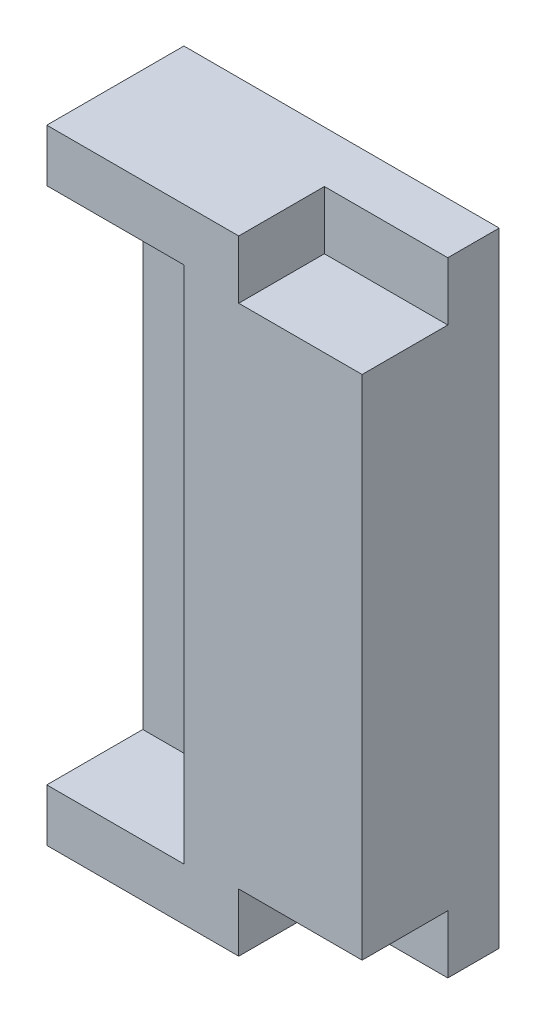
ISO-10303-21;
HEADER;
FILE_DESCRIPTION(('STEP AP214'),'2;1');
FILE_NAME('part.step','',(''),(''),'','','');
FILE_SCHEMA(('AUTOMOTIVE_DESIGN { 1 0 10303 214 1 1 1 1 }'));
ENDSEC;
DATA;
#1=APPLICATION_CONTEXT('core data for automotive mechanical design processes');
#2=APPLICATION_PROTOCOL_DEFINITION('international standard','automotive_design',2000,#1);
#3=PRODUCT_CONTEXT('',#1,'mechanical');
#4=PRODUCT('Part','Part','',(#3));
#5=PRODUCT_RELATED_PRODUCT_CATEGORY('part','',(#4));
#6=PRODUCT_DEFINITION_FORMATION('','',#4);
#7=PRODUCT_DEFINITION_CONTEXT('part definition',#1,'design');
#8=PRODUCT_DEFINITION('design','',#6,#7);
#9=PRODUCT_DEFINITION_SHAPE('','',#8);
#10=(LENGTH_UNIT() NAMED_UNIT(*) SI_UNIT(.MILLI.,.METRE.));
#11=(NAMED_UNIT(*) PLANE_ANGLE_UNIT() SI_UNIT($,.RADIAN.));
#12=(NAMED_UNIT(*) SI_UNIT($,.STERADIAN.) SOLID_ANGLE_UNIT());
#13=UNCERTAINTY_MEASURE_WITH_UNIT(LENGTH_MEASURE(1.E-05),#10,'distance_accuracy_value','');
#14=(GEOMETRIC_REPRESENTATION_CONTEXT(3) GLOBAL_UNCERTAINTY_ASSIGNED_CONTEXT((#13)) GLOBAL_UNIT_ASSIGNED_CONTEXT((#10,
#11,#12)) REPRESENTATION_CONTEXT('',''));
#15=CARTESIAN_POINT('',(0.,0.,0.));
#16=DIRECTION('',(0.,0.,1.));
#17=DIRECTION('',(1.,0.,0.));
#18=AXIS2_PLACEMENT_3D('',#15,#16,#17);
#19=CARTESIAN_POINT('',(0.8,3.7,2.));
#20=DIRECTION('',(0.,-1.,0.));
#21=DIRECTION('',(0.,0.,-1.));
#22=AXIS2_PLACEMENT_3D('',#19,#20,#21);
#23=PLANE('',#22);
#24=DIRECTION('',(1.,0.,0.));
#25=VECTOR('',#24,1.);
#26=CARTESIAN_POINT('',(2.486486486486,3.7,0.75));
#27=LINE('',#26,#25);
#28=CARTESIAN_POINT('',(0.8,3.7,0.75));
#29=VERTEX_POINT('',#28);
#30=CARTESIAN_POINT('',(2.6,3.7,0.75));
#31=VERTEX_POINT('',#30);
#32=EDGE_CURVE('E120',#29,#31,#27,.T.);
#33=ORIENTED_EDGE('',*,*,#32,.F.);
#34=DIRECTION('',(0.,0.,-1.));
#35=VECTOR('',#34,1.);
#36=CARTESIAN_POINT('',(0.8,3.7,2.));
#37=LINE('',#36,#35);
#38=CARTESIAN_POINT('',(0.8,3.7,2.));
#39=VERTEX_POINT('',#38);
#40=EDGE_CURVE('E114',#39,#29,#37,.T.);
#41=ORIENTED_EDGE('',*,*,#40,.F.);
#42=DIRECTION('',(1.,0.,0.));
#43=VECTOR('',#42,1.);
#44=CARTESIAN_POINT('',(0.3,3.7,2.));
#45=LINE('',#44,#43);
#46=CARTESIAN_POINT('',(2.6,3.7,2.));
#47=VERTEX_POINT('',#46);
#48=EDGE_CURVE('E122',#47,#39,#45,.F.);
#49=ORIENTED_EDGE('',*,*,#48,.F.);
#50=DIRECTION('',(0.,0.,-1.));
#51=VECTOR('',#50,1.);
#52=CARTESIAN_POINT('',(2.6,3.7,2.));
#53=LINE('',#52,#51);
#54=EDGE_CURVE('E20',#31,#47,#53,.F.);
#55=ORIENTED_EDGE('',*,*,#54,.F.);
#56=EDGE_LOOP('',(#33,#41,#49,#55));
#57=FACE_BOUND('',#56,.T.);
#58=ADVANCED_FACE('F17',(#57),#23,.F.);
#59=CARTESIAN_POINT('',(-3.,3.785,2.));
#60=DIRECTION('',(0.,-1.,0.));
#61=DIRECTION('',(0.,0.,-1.));
#62=AXIS2_PLACEMENT_3D('',#59,#60,#61);
#63=PLANE('',#62);
#64=DIRECTION('',(1.,0.,0.));
#65=VECTOR('',#64,1.);
#66=CARTESIAN_POINT('',(-1.5,3.785,0.6));
#67=LINE('',#66,#65);
#68=CARTESIAN_POINT('',(0.,3.785,0.6));
#69=VERTEX_POINT('',#68);
#70=CARTESIAN_POINT('',(-2.,3.785,0.6));
#71=VERTEX_POINT('',#70);
#72=EDGE_CURVE('E156',#69,#71,#67,.F.);
#73=ORIENTED_EDGE('',*,*,#72,.F.);
#74=DIRECTION('',(0.,0.,1.));
#75=VECTOR('',#74,1.);
#76=CARTESIAN_POINT('',(0.,3.785,2.));
#77=LINE('',#76,#75);
#78=CARTESIAN_POINT('',(0.,3.785,2.));
#79=VERTEX_POINT('',#78);
#80=EDGE_CURVE('E149',#79,#69,#77,.F.);
#81=ORIENTED_EDGE('',*,*,#80,.F.);
#82=DIRECTION('',(1.,0.,0.));
#83=VECTOR('',#82,1.);
#84=CARTESIAN_POINT('',(0.3,3.785,2.));
#85=LINE('',#84,#83);
#86=CARTESIAN_POINT('',(-2.,3.785,2.));
#87=VERTEX_POINT('',#86);
#88=EDGE_CURVE('E157',#87,#79,#85,.T.);
#89=ORIENTED_EDGE('',*,*,#88,.F.);
#90=DIRECTION('',(0.,0.,-1.));
#91=VECTOR('',#90,1.);
#92=CARTESIAN_POINT('',(-2.,3.785,2.));
#93=LINE('',#92,#91);
#94=EDGE_CURVE('E126',#87,#71,#93,.T.);
#95=ORIENTED_EDGE('',*,*,#94,.T.);
#96=EDGE_LOOP('',(#73,#81,#89,#95));
#97=FACE_BOUND('',#96,.T.);
#98=ADVANCED_FACE('F154',(#97),#63,.T.);
#99=CARTESIAN_POINT('',(0.,3.785,2.));
#100=DIRECTION('',(-1.,0.,0.));
#101=DIRECTION('',(0.,0.,1.));
#102=AXIS2_PLACEMENT_3D('',#99,#100,#101);
#103=PLANE('',#102);
#104=DIRECTION('',(0.,0.,1.));
#105=VECTOR('',#104,1.);
#106=CARTESIAN_POINT('',(0.,-3.785,2.));
#107=LINE('',#106,#105);
#108=CARTESIAN_POINT('',(0.,-3.785,2.));
#109=VERTEX_POINT('',#108);
#110=CARTESIAN_POINT('',(0.,-3.785,0.6));
#111=VERTEX_POINT('',#110);
#112=EDGE_CURVE('E147',#109,#111,#107,.F.);
#113=ORIENTED_EDGE('',*,*,#112,.F.);
#114=DIRECTION('',(0.,1.,0.));
#115=VECTOR('',#114,1.);
#116=CARTESIAN_POINT('',(0.,0.,2.));
#117=LINE('',#116,#115);
#118=EDGE_CURVE('E203',#79,#109,#117,.F.);
#119=ORIENTED_EDGE('',*,*,#118,.F.);
#120=ORIENTED_EDGE('',*,*,#80,.T.);
#121=DIRECTION('',(0.,1.,0.));
#122=VECTOR('',#121,1.);
#123=CARTESIAN_POINT('',(0.,0.,0.6));
#124=LINE('',#123,#122);
#125=EDGE_CURVE('E169',#111,#69,#124,.T.);
#126=ORIENTED_EDGE('',*,*,#125,.F.);
#127=EDGE_LOOP('',(#113,#119,#120,#126));
#128=FACE_BOUND('',#127,.T.);
#129=ADVANCED_FACE('F269',(#128),#103,.T.);
#130=CARTESIAN_POINT('',(0.,-3.785,2.));
#131=DIRECTION('',(0.,1.,0.));
#132=DIRECTION('',(0.,0.,1.));
#133=AXIS2_PLACEMENT_3D('',#130,#131,#132);
#134=PLANE('',#133);
#135=DIRECTION('',(1.,0.,0.));
#136=VECTOR('',#135,1.);
#137=CARTESIAN_POINT('',(-1.5,-3.785,0.6));
#138=LINE('',#137,#136);
#139=CARTESIAN_POINT('',(-2.,-3.785,0.6));
#140=VERTEX_POINT('',#139);
#141=EDGE_CURVE('E170',#140,#111,#138,.T.);
#142=ORIENTED_EDGE('',*,*,#141,.F.);
#143=DIRECTION('',(0.,0.,1.));
#144=VECTOR('',#143,1.);
#145=CARTESIAN_POINT('',(-2.,-3.785,2.));
#146=LINE('',#145,#144);
#147=CARTESIAN_POINT('',(-2.,-3.785,2.));
#148=VERTEX_POINT('',#147);
#149=EDGE_CURVE('E145',#140,#148,#146,.T.);
#150=ORIENTED_EDGE('',*,*,#149,.T.);
#151=DIRECTION('',(1.,0.,0.));
#152=VECTOR('',#151,1.);
#153=CARTESIAN_POINT('',(0.3,-3.785,2.));
#154=LINE('',#153,#152);
#155=EDGE_CURVE('E200',#109,#148,#154,.F.);
#156=ORIENTED_EDGE('',*,*,#155,.F.);
#157=ORIENTED_EDGE('',*,*,#112,.T.);
#158=EDGE_LOOP('',(#142,#150,#156,#157));
#159=FACE_BOUND('',#158,.T.);
#160=ADVANCED_FACE('F267',(#159),#134,.T.);
#161=CARTESIAN_POINT('',(2.7,-3.7,2.));
#162=DIRECTION('',(0.,1.,0.));
#163=DIRECTION('',(0.,0.,1.));
#164=AXIS2_PLACEMENT_3D('',#161,#162,#163);
#165=PLANE('',#164);
#166=DIRECTION('',(1.,0.,0.));
#167=VECTOR('',#166,1.);
#168=CARTESIAN_POINT('',(2.486486486486,-3.7,0.75));
#169=LINE('',#168,#167);
#170=CARTESIAN_POINT('',(2.6,-3.7,0.75));
#171=VERTEX_POINT('',#170);
#172=CARTESIAN_POINT('',(0.8,-3.7,0.75));
#173=VERTEX_POINT('',#172);
#174=EDGE_CURVE('E214',#171,#173,#169,.F.);
#175=ORIENTED_EDGE('',*,*,#174,.F.);
#176=DIRECTION('',(0.,0.,1.));
#177=VECTOR('',#176,1.);
#178=CARTESIAN_POINT('',(2.6,-3.7,2.));
#179=LINE('',#178,#177);
#180=CARTESIAN_POINT('',(2.6,-3.7,2.));
#181=VERTEX_POINT('',#180);
#182=EDGE_CURVE('E133',#181,#171,#179,.F.);
#183=ORIENTED_EDGE('',*,*,#182,.F.);
#184=DIRECTION('',(1.,0.,0.));
#185=VECTOR('',#184,1.);
#186=CARTESIAN_POINT('',(0.3,-3.7,2.));
#187=LINE('',#186,#185);
#188=CARTESIAN_POINT('',(0.8,-3.7,2.));
#189=VERTEX_POINT('',#188);
#190=EDGE_CURVE('E194',#189,#181,#187,.T.);
#191=ORIENTED_EDGE('',*,*,#190,.F.);
#192=DIRECTION('',(0.,0.,-1.));
#193=VECTOR('',#192,1.);
#194=CARTESIAN_POINT('',(0.8,-3.7,2.));
#195=LINE('',#194,#193);
#196=EDGE_CURVE('E209',#173,#189,#195,.F.);
#197=ORIENTED_EDGE('',*,*,#196,.F.);
#198=EDGE_LOOP('',(#175,#183,#191,#197));
#199=FACE_BOUND('',#198,.T.);
#200=ADVANCED_FACE('F277',(#199),#165,.F.);
#201=CARTESIAN_POINT('',(2.486486486486,0.,0.75));
#202=DIRECTION('',(0.,0.,1.));
#203=DIRECTION('',(1.,0.,0.));
#204=AXIS2_PLACEMENT_3D('',#201,#202,#203);
#205=PLANE('',#204);
#206=DIRECTION('',(0.,1.,0.));
#207=VECTOR('',#206,1.);
#208=CARTESIAN_POINT('',(2.6,0.,0.75));
#209=LINE('',#208,#207);
#210=CARTESIAN_POINT('',(2.6,4.55,0.75));
#211=VERTEX_POINT('',#210);
#212=EDGE_CURVE('E130',#31,#211,#209,.T.);
#213=ORIENTED_EDGE('',*,*,#212,.T.);
#214=DIRECTION('',(1.,0.,0.));
#215=VECTOR('',#214,1.);
#216=CARTESIAN_POINT('',(2.6,4.55,0.75));
#217=LINE('',#216,#215);
#218=CARTESIAN_POINT('',(0.8,4.55,0.75));
#219=VERTEX_POINT('',#218);
#220=EDGE_CURVE('E192',#211,#219,#217,.F.);
#221=ORIENTED_EDGE('',*,*,#220,.T.);
#222=DIRECTION('',(0.,1.,0.));
#223=VECTOR('',#222,1.);
#224=CARTESIAN_POINT('',(0.8,3.7,0.75));
#225=LINE('',#224,#223);
#226=EDGE_CURVE('E132',#29,#219,#225,.T.);
#227=ORIENTED_EDGE('',*,*,#226,.F.);
#228=ORIENTED_EDGE('',*,*,#32,.T.);
#229=EDGE_LOOP('',(#213,#221,#227,#228));
#230=FACE_BOUND('',#229,.T.);
#231=ADVANCED_FACE('F128',(#230),#205,.T.);
#232=CARTESIAN_POINT('',(0.8,3.7,2.));
#233=DIRECTION('',(1.,0.,0.));
#234=DIRECTION('',(0.,0.,-1.));
#235=AXIS2_PLACEMENT_3D('',#232,#233,#234);
#236=PLANE('',#235);
#237=ORIENTED_EDGE('',*,*,#226,.T.);
#238=DIRECTION('',(0.,0.,-1.));
#239=VECTOR('',#238,1.);
#240=CARTESIAN_POINT('',(0.8,4.55,0.));
#241=LINE('',#240,#239);
#242=CARTESIAN_POINT('',(0.8,4.55,2.));
#243=VERTEX_POINT('',#242);
#244=EDGE_CURVE('E189',#219,#243,#241,.F.);
#245=ORIENTED_EDGE('',*,*,#244,.T.);
#246=DIRECTION('',(0.,1.,0.));
#247=VECTOR('',#246,1.);
#248=CARTESIAN_POINT('',(0.8,0.,2.));
#249=LINE('',#248,#247);
#250=EDGE_CURVE('E206',#39,#243,#249,.T.);
#251=ORIENTED_EDGE('',*,*,#250,.F.);
#252=ORIENTED_EDGE('',*,*,#40,.T.);
#253=EDGE_LOOP('',(#237,#245,#251,#252));
#254=FACE_BOUND('',#253,.T.);
#255=ADVANCED_FACE('F220',(#254),#236,.T.);
#256=CARTESIAN_POINT('',(-1.5,0.,0.6));
#257=DIRECTION('',(0.,0.,1.));
#258=DIRECTION('',(1.,0.,0.));
#259=AXIS2_PLACEMENT_3D('',#256,#257,#258);
#260=PLANE('',#259);
#261=ORIENTED_EDGE('',*,*,#141,.T.);
#262=ORIENTED_EDGE('',*,*,#125,.T.);
#263=ORIENTED_EDGE('',*,*,#72,.T.);
#264=DIRECTION('',(0.,1.,0.));
#265=VECTOR('',#264,1.);
#266=CARTESIAN_POINT('',(-2.,4.55,0.6));
#267=LINE('',#266,#265);
#268=EDGE_CURVE('E167',#71,#140,#267,.F.);
#269=ORIENTED_EDGE('',*,*,#268,.T.);
#270=EDGE_LOOP('',(#261,#262,#263,#269));
#271=FACE_BOUND('',#270,.T.);
#272=ADVANCED_FACE('F166',(#271),#260,.T.);
#273=CARTESIAN_POINT('',(2.486486486486,0.,0.75));
#274=DIRECTION('',(0.,0.,1.));
#275=DIRECTION('',(1.,0.,0.));
#276=AXIS2_PLACEMENT_3D('',#273,#274,#275);
#277=PLANE('',#276);
#278=DIRECTION('',(0.,1.,0.));
#279=VECTOR('',#278,1.);
#280=CARTESIAN_POINT('',(0.8,-5.2,0.75));
#281=LINE('',#280,#279);
#282=CARTESIAN_POINT('',(0.8,-4.55,0.75));
#283=VERTEX_POINT('',#282);
#284=EDGE_CURVE('E211',#283,#173,#281,.T.);
#285=ORIENTED_EDGE('',*,*,#284,.F.);
#286=DIRECTION('',(1.,0.,0.));
#287=VECTOR('',#286,1.);
#288=CARTESIAN_POINT('',(2.6,-4.55,0.75));
#289=LINE('',#288,#287);
#290=CARTESIAN_POINT('',(2.6,-4.55,0.75));
#291=VERTEX_POINT('',#290);
#292=EDGE_CURVE('E179',#291,#283,#289,.F.);
#293=ORIENTED_EDGE('',*,*,#292,.F.);
#294=DIRECTION('',(0.,1.,0.));
#295=VECTOR('',#294,1.);
#296=CARTESIAN_POINT('',(2.6,0.,0.75));
#297=LINE('',#296,#295);
#298=EDGE_CURVE('E216',#291,#171,#297,.T.);
#299=ORIENTED_EDGE('',*,*,#298,.T.);
#300=ORIENTED_EDGE('',*,*,#174,.T.);
#301=EDGE_LOOP('',(#285,#293,#299,#300));
#302=FACE_BOUND('',#301,.T.);
#303=ADVANCED_FACE('F256',(#302),#277,.T.);
#304=CARTESIAN_POINT('',(0.8,-5.2,2.));
#305=DIRECTION('',(1.,0.,0.));
#306=DIRECTION('',(0.,0.,-1.));
#307=AXIS2_PLACEMENT_3D('',#304,#305,#306);
#308=PLANE('',#307);
#309=ORIENTED_EDGE('',*,*,#284,.T.);
#310=ORIENTED_EDGE('',*,*,#196,.T.);
#311=DIRECTION('',(0.,1.,0.));
#312=VECTOR('',#311,1.);
#313=CARTESIAN_POINT('',(0.8,0.,2.));
#314=LINE('',#313,#312);
#315=CARTESIAN_POINT('',(0.8,-4.55,2.));
#316=VERTEX_POINT('',#315);
#317=EDGE_CURVE('E197',#316,#189,#314,.T.);
#318=ORIENTED_EDGE('',*,*,#317,.F.);
#319=DIRECTION('',(0.,0.,-1.));
#320=VECTOR('',#319,1.);
#321=CARTESIAN_POINT('',(0.8,-4.55,0.));
#322=LINE('',#321,#320);
#323=EDGE_CURVE('E248',#283,#316,#322,.F.);
#324=ORIENTED_EDGE('',*,*,#323,.F.);
#325=EDGE_LOOP('',(#309,#310,#318,#324));
#326=FACE_BOUND('',#325,.T.);
#327=ADVANCED_FACE('F260',(#326),#308,.T.);
#328=CARTESIAN_POINT('',(0.3,0.,2.));
#329=DIRECTION('',(0.,0.,1.));
#330=DIRECTION('',(1.,0.,0.));
#331=AXIS2_PLACEMENT_3D('',#328,#329,#330);
#332=PLANE('',#331);
#333=ORIENTED_EDGE('',*,*,#317,.T.);
#334=ORIENTED_EDGE('',*,*,#190,.T.);
#335=DIRECTION('',(0.,1.,0.));
#336=VECTOR('',#335,1.);
#337=CARTESIAN_POINT('',(2.6,4.55,2.));
#338=LINE('',#337,#336);
#339=EDGE_CURVE('E238',#47,#181,#338,.F.);
#340=ORIENTED_EDGE('',*,*,#339,.F.);
#341=ORIENTED_EDGE('',*,*,#48,.T.);
#342=ORIENTED_EDGE('',*,*,#250,.T.);
#343=DIRECTION('',(1.,0.,0.));
#344=VECTOR('',#343,1.);
#345=CARTESIAN_POINT('',(2.6,4.55,2.));
#346=LINE('',#345,#344);
#347=CARTESIAN_POINT('',(-2.,4.55,2.));
#348=VERTEX_POINT('',#347);
#349=EDGE_CURVE('E187',#243,#348,#346,.F.);
#350=ORIENTED_EDGE('',*,*,#349,.T.);
#351=DIRECTION('',(0.,1.,0.));
#352=VECTOR('',#351,1.);
#353=CARTESIAN_POINT('',(-2.,4.55,2.));
#354=LINE('',#353,#352);
#355=EDGE_CURVE('E176',#348,#87,#354,.F.);
#356=ORIENTED_EDGE('',*,*,#355,.T.);
#357=ORIENTED_EDGE('',*,*,#88,.T.);
#358=ORIENTED_EDGE('',*,*,#118,.T.);
#359=ORIENTED_EDGE('',*,*,#155,.T.);
#360=DIRECTION('',(0.,1.,0.));
#361=VECTOR('',#360,1.);
#362=CARTESIAN_POINT('',(-2.,4.55,2.));
#363=LINE('',#362,#361);
#364=CARTESIAN_POINT('',(-2.,-4.55,2.));
#365=VERTEX_POINT('',#364);
#366=EDGE_CURVE('E175',#148,#365,#363,.F.);
#367=ORIENTED_EDGE('',*,*,#366,.T.);
#368=DIRECTION('',(1.,0.,0.));
#369=VECTOR('',#368,1.);
#370=CARTESIAN_POINT('',(2.6,-4.55,2.));
#371=LINE('',#370,#369);
#372=EDGE_CURVE('E246',#316,#365,#371,.F.);
#373=ORIENTED_EDGE('',*,*,#372,.F.);
#374=EDGE_LOOP('',(#333,#334,#340,#341,#342,#350,#356,#357,#358,#359,#367,#373));
#375=FACE_BOUND('',#374,.T.);
#376=ADVANCED_FACE('F226',(#375),#332,.T.);
#377=CARTESIAN_POINT('',(2.6,4.55,0.));
#378=DIRECTION('',(0.,-1.,0.));
#379=DIRECTION('',(0.,0.,-1.));
#380=AXIS2_PLACEMENT_3D('',#377,#378,#379);
#381=PLANE('',#380);
#382=ORIENTED_EDGE('',*,*,#349,.F.);
#383=ORIENTED_EDGE('',*,*,#244,.F.);
#384=ORIENTED_EDGE('',*,*,#220,.F.);
#385=DIRECTION('',(0.,0.,-1.));
#386=VECTOR('',#385,1.);
#387=CARTESIAN_POINT('',(2.6,4.55,0.));
#388=LINE('',#387,#386);
#389=CARTESIAN_POINT('',(2.6,4.55,0.));
#390=VERTEX_POINT('',#389);
#391=EDGE_CURVE('E138',#390,#211,#388,.F.);
#392=ORIENTED_EDGE('',*,*,#391,.F.);
#393=DIRECTION('',(1.,0.,0.));
#394=VECTOR('',#393,1.);
#395=CARTESIAN_POINT('',(0.3,4.55,0.));
#396=LINE('',#395,#394);
#397=CARTESIAN_POINT('',(-2.,4.55,0.));
#398=VERTEX_POINT('',#397);
#399=EDGE_CURVE('E234',#390,#398,#396,.F.);
#400=ORIENTED_EDGE('',*,*,#399,.T.);
#401=DIRECTION('',(0.,0.,-1.));
#402=VECTOR('',#401,1.);
#403=CARTESIAN_POINT('',(-2.,4.55,0.));
#404=LINE('',#403,#402);
#405=EDGE_CURVE('E181',#398,#348,#404,.F.);
#406=ORIENTED_EDGE('',*,*,#405,.T.);
#407=EDGE_LOOP('',(#382,#383,#384,#392,#400,#406));
#408=FACE_BOUND('',#407,.T.);
#409=ADVANCED_FACE('F223',(#408),#381,.F.);
#410=CARTESIAN_POINT('',(-2.,4.55,0.));
#411=DIRECTION('',(1.,0.,0.));
#412=DIRECTION('',(0.,0.,-1.));
#413=AXIS2_PLACEMENT_3D('',#410,#411,#412);
#414=PLANE('',#413);
#415=ORIENTED_EDGE('',*,*,#366,.F.);
#416=ORIENTED_EDGE('',*,*,#149,.F.);
#417=ORIENTED_EDGE('',*,*,#268,.F.);
#418=ORIENTED_EDGE('',*,*,#94,.F.);
#419=ORIENTED_EDGE('',*,*,#355,.F.);
#420=ORIENTED_EDGE('',*,*,#405,.F.);
#421=DIRECTION('',(0.,1.,0.));
#422=VECTOR('',#421,1.);
#423=CARTESIAN_POINT('',(-2.,0.,0.));
#424=LINE('',#423,#422);
#425=CARTESIAN_POINT('',(-2.,-4.55,0.));
#426=VERTEX_POINT('',#425);
#427=EDGE_CURVE('E230',#398,#426,#424,.F.);
#428=ORIENTED_EDGE('',*,*,#427,.T.);
#429=DIRECTION('',(0.,0.,-1.));
#430=VECTOR('',#429,1.);
#431=CARTESIAN_POINT('',(-2.,-4.55,0.));
#432=LINE('',#431,#430);
#433=EDGE_CURVE('E244',#365,#426,#432,.T.);
#434=ORIENTED_EDGE('',*,*,#433,.F.);
#435=EDGE_LOOP('',(#415,#416,#417,#418,#419,#420,#428,#434));
#436=FACE_BOUND('',#435,.T.);
#437=ADVANCED_FACE('F173',(#436),#414,.F.);
#438=CARTESIAN_POINT('',(2.6,-4.55,0.));
#439=DIRECTION('',(0.,-1.,0.));
#440=DIRECTION('',(0.,0.,-1.));
#441=AXIS2_PLACEMENT_3D('',#438,#439,#440);
#442=PLANE('',#441);
#443=ORIENTED_EDGE('',*,*,#372,.T.);
#444=ORIENTED_EDGE('',*,*,#433,.T.);
#445=DIRECTION('',(1.,0.,0.));
#446=VECTOR('',#445,1.);
#447=CARTESIAN_POINT('',(0.3,-4.55,0.));
#448=LINE('',#447,#446);
#449=CARTESIAN_POINT('',(2.6,-4.55,0.));
#450=VERTEX_POINT('',#449);
#451=EDGE_CURVE('E26',#426,#450,#448,.T.);
#452=ORIENTED_EDGE('',*,*,#451,.T.);
#453=DIRECTION('',(0.,0.,-1.));
#454=VECTOR('',#453,1.);
#455=CARTESIAN_POINT('',(2.6,-4.55,0.));
#456=LINE('',#455,#454);
#457=EDGE_CURVE('E34',#291,#450,#456,.T.);
#458=ORIENTED_EDGE('',*,*,#457,.F.);
#459=ORIENTED_EDGE('',*,*,#292,.T.);
#460=ORIENTED_EDGE('',*,*,#323,.T.);
#461=EDGE_LOOP('',(#443,#444,#452,#458,#459,#460));
#462=FACE_BOUND('',#461,.T.);
#463=ADVANCED_FACE('F252',(#462),#442,.T.);
#464=CARTESIAN_POINT('',(2.6,4.55,0.));
#465=DIRECTION('',(1.,0.,0.));
#466=DIRECTION('',(0.,0.,-1.));
#467=AXIS2_PLACEMENT_3D('',#464,#465,#466);
#468=PLANE('',#467);
#469=ORIENTED_EDGE('',*,*,#298,.F.);
#470=ORIENTED_EDGE('',*,*,#457,.T.);
#471=DIRECTION('',(0.,1.,0.));
#472=VECTOR('',#471,1.);
#473=CARTESIAN_POINT('',(2.6,0.,0.));
#474=LINE('',#473,#472);
#475=EDGE_CURVE('E11',#450,#390,#474,.T.);
#476=ORIENTED_EDGE('',*,*,#475,.T.);
#477=ORIENTED_EDGE('',*,*,#391,.T.);
#478=ORIENTED_EDGE('',*,*,#212,.F.);
#479=ORIENTED_EDGE('',*,*,#54,.T.);
#480=ORIENTED_EDGE('',*,*,#339,.T.);
#481=ORIENTED_EDGE('',*,*,#182,.T.);
#482=EDGE_LOOP('',(#469,#470,#476,#477,#478,#479,#480,#481));
#483=FACE_BOUND('',#482,.T.);
#484=ADVANCED_FACE('F136',(#483),#468,.T.);
#485=CARTESIAN_POINT('',(0.3,0.,0.));
#486=DIRECTION('',(0.,0.,1.));
#487=DIRECTION('',(1.,0.,0.));
#488=AXIS2_PLACEMENT_3D('',#485,#486,#487);
#489=PLANE('',#488);
#490=ORIENTED_EDGE('',*,*,#451,.F.);
#491=ORIENTED_EDGE('',*,*,#427,.F.);
#492=ORIENTED_EDGE('',*,*,#399,.F.);
#493=ORIENTED_EDGE('',*,*,#475,.F.);
#494=EDGE_LOOP('',(#490,#491,#492,#493));
#495=FACE_BOUND('',#494,.T.);
#496=ADVANCED_FACE('F233',(#495),#489,.F.);
#497=CLOSED_SHELL('',(#58,#98,#129,#160,#200,#231,#255,#272,#303,#327,#376,#409,#437,#463,#484,#496));
#498=MANIFOLD_SOLID_BREP('B1',#497);
#499=ADVANCED_BREP_SHAPE_REPRESENTATION('',(#18,#498),#14);
#500=SHAPE_DEFINITION_REPRESENTATION(#9,#499);
ENDSEC;
END-ISO-10303-21;
